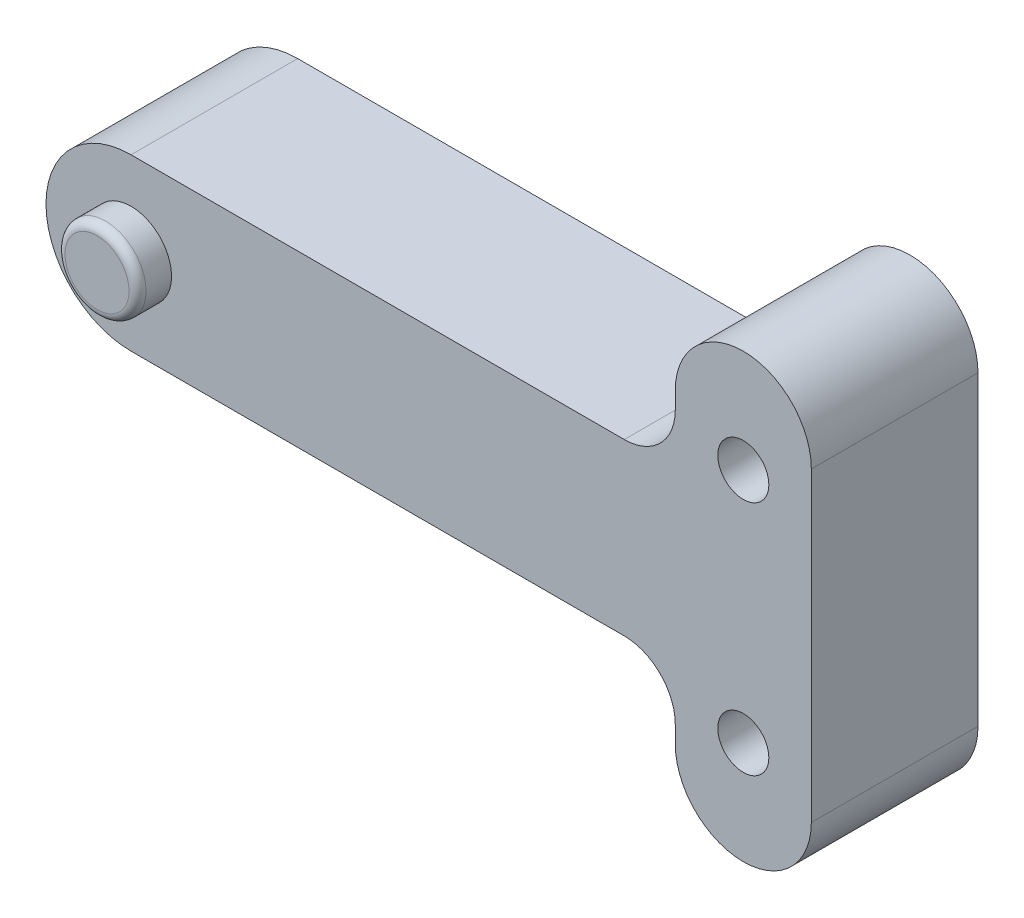
ISO-10303-21;
HEADER;
FILE_DESCRIPTION(('STEP AP214'),'2;1');
FILE_NAME('part.step','',(''),(''),'','','');
FILE_SCHEMA(('AUTOMOTIVE_DESIGN { 1 0 10303 214 1 1 1 1 }'));
ENDSEC;
DATA;
#1=APPLICATION_CONTEXT('core data for automotive mechanical design processes');
#2=APPLICATION_PROTOCOL_DEFINITION('international standard','automotive_design',2000,#1);
#3=PRODUCT_CONTEXT('',#1,'mechanical');
#4=PRODUCT('Part','Part','',(#3));
#5=PRODUCT_RELATED_PRODUCT_CATEGORY('part','',(#4));
#6=PRODUCT_DEFINITION_FORMATION('','',#4);
#7=PRODUCT_DEFINITION_CONTEXT('part definition',#1,'design');
#8=PRODUCT_DEFINITION('design','',#6,#7);
#9=PRODUCT_DEFINITION_SHAPE('','',#8);
#10=(LENGTH_UNIT() NAMED_UNIT(*) SI_UNIT(.MILLI.,.METRE.));
#11=(NAMED_UNIT(*) PLANE_ANGLE_UNIT() SI_UNIT($,.RADIAN.));
#12=(NAMED_UNIT(*) SI_UNIT($,.STERADIAN.) SOLID_ANGLE_UNIT());
#13=UNCERTAINTY_MEASURE_WITH_UNIT(LENGTH_MEASURE(1.E-05),#10,'distance_accuracy_value','');
#14=(GEOMETRIC_REPRESENTATION_CONTEXT(3) GLOBAL_UNCERTAINTY_ASSIGNED_CONTEXT((#13)) GLOBAL_UNIT_ASSIGNED_CONTEXT((#10,
#11,#12)) REPRESENTATION_CONTEXT('',''));
#15=CARTESIAN_POINT('',(0.,0.,0.));
#16=DIRECTION('',(0.,0.,1.));
#17=DIRECTION('',(1.,0.,0.));
#18=AXIS2_PLACEMENT_3D('',#15,#16,#17);
#19=CARTESIAN_POINT('',(-5.,-5.,4.9));
#20=DIRECTION('',(0.,0.,-1.));
#21=DIRECTION('',(-1.,0.,0.));
#22=AXIS2_PLACEMENT_3D('',#19,#20,#21);
#23=PLANE('',#22);
#24=CARTESIAN_POINT('',(0.,0.,4.9));
#25=DIRECTION('',(0.,0.,-1.));
#26=DIRECTION('',(-1.,0.,0.));
#27=AXIS2_PLACEMENT_3D('',#24,#25,#26);
#28=CIRCLE('',#27,2.38);
#29=CARTESIAN_POINT('',(-2.38,0.,4.9));
#30=VERTEX_POINT('',#29);
#31=EDGE_CURVE('E186',#30,#30,#28,.F.);
#32=ORIENTED_EDGE('',*,*,#31,.F.);
#33=EDGE_LOOP('',(#32));
#34=FACE_BOUND('',#33,.T.);
#35=DIRECTION('',(0.,-1.,0.));
#36=VECTOR('',#35,1.);
#37=CARTESIAN_POINT('',(40.,5.00000000000001,4.9));
#38=LINE('',#37,#36);
#39=CARTESIAN_POINT('',(40.,9.,4.9));
#40=VERTEX_POINT('',#39);
#41=CARTESIAN_POINT('',(40.,-9.,4.9));
#42=VERTEX_POINT('',#41);
#43=EDGE_CURVE('E174',#40,#42,#38,.T.);
#44=ORIENTED_EDGE('',*,*,#43,.F.);
#45=CARTESIAN_POINT('',(36.,9.,4.9));
#46=DIRECTION('',(0.,0.,-1.));
#47=DIRECTION('',(-1.,0.,0.));
#48=AXIS2_PLACEMENT_3D('',#45,#46,#47);
#49=CIRCLE('',#48,4.);
#50=CARTESIAN_POINT('',(32.,9.,4.9));
#51=VERTEX_POINT('',#50);
#52=EDGE_CURVE('E171',#51,#40,#49,.T.);
#53=ORIENTED_EDGE('',*,*,#52,.F.);
#54=DIRECTION('',(0.,1.,0.));
#55=VECTOR('',#54,1.);
#56=CARTESIAN_POINT('',(32.,9.,4.9));
#57=LINE('',#56,#55);
#58=CARTESIAN_POINT('',(32.,8.,4.9));
#59=VERTEX_POINT('',#58);
#60=EDGE_CURVE('E167',#59,#51,#57,.T.);
#61=ORIENTED_EDGE('',*,*,#60,.F.);
#62=CARTESIAN_POINT('',(29.,8.,4.9));
#63=DIRECTION('',(0.,0.,-1.));
#64=DIRECTION('',(-1.,0.,0.));
#65=AXIS2_PLACEMENT_3D('',#62,#63,#64);
#66=CIRCLE('',#65,3.);
#67=CARTESIAN_POINT('',(29.,5.,4.9));
#68=VERTEX_POINT('',#67);
#69=EDGE_CURVE('E56',#59,#68,#66,.T.);
#70=ORIENTED_EDGE('',*,*,#69,.T.);
#71=DIRECTION('',(1.,0.,0.));
#72=VECTOR('',#71,1.);
#73=CARTESIAN_POINT('',(0.,5.,4.9));
#74=LINE('',#73,#72);
#75=CARTESIAN_POINT('',(0.,5.,4.9));
#76=VERTEX_POINT('',#75);
#77=EDGE_CURVE('E214',#76,#68,#74,.T.);
#78=ORIENTED_EDGE('',*,*,#77,.F.);
#79=CARTESIAN_POINT('',(0.,0.,4.9));
#80=DIRECTION('',(0.,0.,-1.));
#81=DIRECTION('',(-1.,0.,0.));
#82=AXIS2_PLACEMENT_3D('',#79,#80,#81);
#83=CIRCLE('',#82,5.);
#84=CARTESIAN_POINT('',(0.,-5.,4.9));
#85=VERTEX_POINT('',#84);
#86=EDGE_CURVE('E196',#76,#85,#83,.F.);
#87=ORIENTED_EDGE('',*,*,#86,.T.);
#88=DIRECTION('',(-1.,0.,0.));
#89=VECTOR('',#88,1.);
#90=CARTESIAN_POINT('',(-5.,-5.,4.9));
#91=LINE('',#90,#89);
#92=CARTESIAN_POINT('',(29.,-5.,4.9));
#93=VERTEX_POINT('',#92);
#94=EDGE_CURVE('E185',#93,#85,#91,.T.);
#95=ORIENTED_EDGE('',*,*,#94,.F.);
#96=CARTESIAN_POINT('',(29.,-8.,4.9));
#97=DIRECTION('',(0.,0.,-1.));
#98=DIRECTION('',(-1.,0.,0.));
#99=AXIS2_PLACEMENT_3D('',#96,#97,#98);
#100=CIRCLE('',#99,3.);
#101=CARTESIAN_POINT('',(32.,-8.,4.9));
#102=VERTEX_POINT('',#101);
#103=EDGE_CURVE('E261',#93,#102,#100,.T.);
#104=ORIENTED_EDGE('',*,*,#103,.T.);
#105=CARTESIAN_POINT('',(32.,-9.,4.9));
#106=VERTEX_POINT('',#105);
#107=EDGE_CURVE('E168',#106,#102,#57,.T.);
#108=ORIENTED_EDGE('',*,*,#107,.F.);
#109=CARTESIAN_POINT('',(36.,-9.,4.9));
#110=DIRECTION('',(0.,0.,-1.));
#111=DIRECTION('',(-1.,0.,0.));
#112=AXIS2_PLACEMENT_3D('',#109,#110,#111);
#113=CIRCLE('',#112,4.);
#114=EDGE_CURVE('E131',#42,#106,#113,.T.);
#115=ORIENTED_EDGE('',*,*,#114,.F.);
#116=EDGE_LOOP('',(#44,#53,#61,#70,#78,#87,#95,#104,#108,#115));
#117=FACE_BOUND('',#116,.T.);
#118=CARTESIAN_POINT('',(36.,-6.95,4.9));
#119=DIRECTION('',(0.,0.,-1.));
#120=DIRECTION('',(-1.,0.,0.));
#121=AXIS2_PLACEMENT_3D('',#118,#119,#120);
#122=CIRCLE('',#121,1.5);
#123=CARTESIAN_POINT('',(34.5,-6.95,4.9));
#124=VERTEX_POINT('',#123);
#125=EDGE_CURVE('E242',#124,#124,#122,.F.);
#126=ORIENTED_EDGE('',*,*,#125,.F.);
#127=EDGE_LOOP('',(#126));
#128=FACE_BOUND('',#127,.T.);
#129=CARTESIAN_POINT('',(36.,6.95,4.9));
#130=DIRECTION('',(0.,0.,-1.));
#131=DIRECTION('',(-1.,0.,0.));
#132=AXIS2_PLACEMENT_3D('',#129,#130,#131);
#133=CIRCLE('',#132,1.5);
#134=CARTESIAN_POINT('',(34.5,6.95,4.9));
#135=VERTEX_POINT('',#134);
#136=EDGE_CURVE('E149',#135,#135,#133,.T.);
#137=ORIENTED_EDGE('',*,*,#136,.T.);
#138=EDGE_LOOP('',(#137));
#139=FACE_BOUND('',#138,.T.);
#140=ADVANCED_FACE('F47',(#34,#117,#128,#139),#23,.F.);
#141=CARTESIAN_POINT('',(-5.,-5.,-4.9));
#142=DIRECTION('',(0.,0.,1.));
#143=DIRECTION('',(1.,0.,0.));
#144=AXIS2_PLACEMENT_3D('',#141,#142,#143);
#145=PLANE('',#144);
#146=CARTESIAN_POINT('',(0.,0.,-4.9));
#147=DIRECTION('',(0.,0.,1.));
#148=DIRECTION('',(1.,0.,0.));
#149=AXIS2_PLACEMENT_3D('',#146,#147,#148);
#150=CIRCLE('',#149,2.38);
#151=CARTESIAN_POINT('',(2.38,0.,-4.9));
#152=VERTEX_POINT('',#151);
#153=EDGE_CURVE('E191',#152,#152,#150,.F.);
#154=ORIENTED_EDGE('',*,*,#153,.F.);
#155=EDGE_LOOP('',(#154));
#156=FACE_BOUND('',#155,.T.);
#157=DIRECTION('',(0.,1.,0.));
#158=VECTOR('',#157,1.);
#159=CARTESIAN_POINT('',(40.,-4.99999999999999,-4.9));
#160=LINE('',#159,#158);
#161=CARTESIAN_POINT('',(40.,-9.,-4.9));
#162=VERTEX_POINT('',#161);
#163=CARTESIAN_POINT('',(40.,9.,-4.9));
#164=VERTEX_POINT('',#163);
#165=EDGE_CURVE('E145',#162,#164,#160,.T.);
#166=ORIENTED_EDGE('',*,*,#165,.F.);
#167=CARTESIAN_POINT('',(36.,-9.,-4.9));
#168=DIRECTION('',(0.,0.,1.));
#169=DIRECTION('',(1.,0.,0.));
#170=AXIS2_PLACEMENT_3D('',#167,#168,#169);
#171=CIRCLE('',#170,4.);
#172=CARTESIAN_POINT('',(32.,-9.,-4.9));
#173=VERTEX_POINT('',#172);
#174=EDGE_CURVE('E129',#162,#173,#171,.F.);
#175=ORIENTED_EDGE('',*,*,#174,.T.);
#176=DIRECTION('',(0.,1.,0.));
#177=VECTOR('',#176,1.);
#178=CARTESIAN_POINT('',(32.,9.,-4.9));
#179=LINE('',#178,#177);
#180=CARTESIAN_POINT('',(32.,-8.,-4.9));
#181=VERTEX_POINT('',#180);
#182=EDGE_CURVE('E143',#173,#181,#179,.T.);
#183=ORIENTED_EDGE('',*,*,#182,.T.);
#184=CARTESIAN_POINT('',(29.,-8.,-4.9));
#185=DIRECTION('',(0.,0.,1.));
#186=DIRECTION('',(1.,0.,0.));
#187=AXIS2_PLACEMENT_3D('',#184,#185,#186);
#188=CIRCLE('',#187,3.);
#189=CARTESIAN_POINT('',(29.,-5.,-4.9));
#190=VERTEX_POINT('',#189);
#191=EDGE_CURVE('E258',#181,#190,#188,.T.);
#192=ORIENTED_EDGE('',*,*,#191,.T.);
#193=DIRECTION('',(1.,0.,0.));
#194=VECTOR('',#193,1.);
#195=CARTESIAN_POINT('',(-5.,-5.,-4.9));
#196=LINE('',#195,#194);
#197=CARTESIAN_POINT('',(0.,-5.,-4.9));
#198=VERTEX_POINT('',#197);
#199=EDGE_CURVE('E192',#198,#190,#196,.T.);
#200=ORIENTED_EDGE('',*,*,#199,.F.);
#201=CARTESIAN_POINT('',(0.,0.,-4.9));
#202=DIRECTION('',(0.,0.,1.));
#203=DIRECTION('',(1.,0.,0.));
#204=AXIS2_PLACEMENT_3D('',#201,#202,#203);
#205=CIRCLE('',#204,5.);
#206=CARTESIAN_POINT('',(0.,5.,-4.9));
#207=VERTEX_POINT('',#206);
#208=EDGE_CURVE('E202',#198,#207,#205,.F.);
#209=ORIENTED_EDGE('',*,*,#208,.T.);
#210=DIRECTION('',(-1.,0.,0.));
#211=VECTOR('',#210,1.);
#212=CARTESIAN_POINT('',(0.,5.,-4.9));
#213=LINE('',#212,#211);
#214=CARTESIAN_POINT('',(29.,5.,-4.9));
#215=VERTEX_POINT('',#214);
#216=EDGE_CURVE('E217',#215,#207,#213,.T.);
#217=ORIENTED_EDGE('',*,*,#216,.F.);
#218=CARTESIAN_POINT('',(29.,8.,-4.9));
#219=DIRECTION('',(0.,0.,1.));
#220=DIRECTION('',(1.,0.,0.));
#221=AXIS2_PLACEMENT_3D('',#218,#219,#220);
#222=CIRCLE('',#221,3.);
#223=CARTESIAN_POINT('',(32.,8.,-4.9));
#224=VERTEX_POINT('',#223);
#225=EDGE_CURVE('E12',#215,#224,#222,.T.);
#226=ORIENTED_EDGE('',*,*,#225,.T.);
#227=CARTESIAN_POINT('',(32.,9.,-4.9));
#228=VERTEX_POINT('',#227);
#229=EDGE_CURVE('E157',#224,#228,#179,.T.);
#230=ORIENTED_EDGE('',*,*,#229,.T.);
#231=CARTESIAN_POINT('',(36.,9.,-4.9));
#232=DIRECTION('',(0.,0.,1.));
#233=DIRECTION('',(1.,0.,0.));
#234=AXIS2_PLACEMENT_3D('',#231,#232,#233);
#235=CIRCLE('',#234,4.);
#236=EDGE_CURVE('E148',#228,#164,#235,.F.);
#237=ORIENTED_EDGE('',*,*,#236,.T.);
#238=EDGE_LOOP('',(#166,#175,#183,#192,#200,#209,#217,#226,#230,#237));
#239=FACE_BOUND('',#238,.T.);
#240=CARTESIAN_POINT('',(36.,-6.95,-4.9));
#241=DIRECTION('',(0.,0.,1.));
#242=DIRECTION('',(1.,0.,0.));
#243=AXIS2_PLACEMENT_3D('',#240,#241,#242);
#244=CIRCLE('',#243,1.5);
#245=CARTESIAN_POINT('',(37.5,-6.95,-4.9));
#246=VERTEX_POINT('',#245);
#247=EDGE_CURVE('E238',#246,#246,#244,.F.);
#248=ORIENTED_EDGE('',*,*,#247,.F.);
#249=EDGE_LOOP('',(#248));
#250=FACE_BOUND('',#249,.T.);
#251=CARTESIAN_POINT('',(36.,6.95,-4.9));
#252=DIRECTION('',(0.,0.,1.));
#253=DIRECTION('',(1.,0.,0.));
#254=AXIS2_PLACEMENT_3D('',#251,#252,#253);
#255=CIRCLE('',#254,1.5);
#256=CARTESIAN_POINT('',(37.5,6.95,-4.9));
#257=VERTEX_POINT('',#256);
#258=EDGE_CURVE('E243',#257,#257,#255,.T.);
#259=ORIENTED_EDGE('',*,*,#258,.T.);
#260=EDGE_LOOP('',(#259));
#261=FACE_BOUND('',#260,.T.);
#262=ADVANCED_FACE('F141',(#156,#239,#250,#261),#145,.F.);
#263=CARTESIAN_POINT('',(0.,-5.,-20.));
#264=DIRECTION('',(0.,1.,0.));
#265=DIRECTION('',(0.,0.,1.));
#266=AXIS2_PLACEMENT_3D('',#263,#264,#265);
#267=PLANE('',#266);
#268=ORIENTED_EDGE('',*,*,#199,.T.);
#269=DIRECTION('',(0.,0.,-1.));
#270=VECTOR('',#269,1.);
#271=CARTESIAN_POINT('',(29.,-5.,4.9));
#272=LINE('',#271,#270);
#273=EDGE_CURVE('E249',#190,#93,#272,.F.);
#274=ORIENTED_EDGE('',*,*,#273,.T.);
#275=ORIENTED_EDGE('',*,*,#94,.T.);
#276=DIRECTION('',(0.,0.,1.));
#277=VECTOR('',#276,1.);
#278=CARTESIAN_POINT('',(0.,-5.,-20.));
#279=LINE('',#278,#277);
#280=EDGE_CURVE('E210',#198,#85,#279,.T.);
#281=ORIENTED_EDGE('',*,*,#280,.F.);
#282=EDGE_LOOP('',(#268,#274,#275,#281));
#283=FACE_BOUND('',#282,.T.);
#284=ADVANCED_FACE('F333',(#283),#267,.F.);
#285=CARTESIAN_POINT('',(0.,5.,-20.));
#286=DIRECTION('',(0.,-1.,0.));
#287=DIRECTION('',(0.,0.,-1.));
#288=AXIS2_PLACEMENT_3D('',#285,#286,#287);
#289=PLANE('',#288);
#290=ORIENTED_EDGE('',*,*,#77,.T.);
#291=DIRECTION('',(0.,0.,1.));
#292=VECTOR('',#291,1.);
#293=CARTESIAN_POINT('',(29.,5.,-4.9));
#294=LINE('',#293,#292);
#295=EDGE_CURVE('E69',#68,#215,#294,.F.);
#296=ORIENTED_EDGE('',*,*,#295,.T.);
#297=ORIENTED_EDGE('',*,*,#216,.T.);
#298=DIRECTION('',(0.,0.,1.));
#299=VECTOR('',#298,1.);
#300=CARTESIAN_POINT('',(0.,5.,-20.));
#301=LINE('',#300,#299);
#302=EDGE_CURVE('E206',#207,#76,#301,.T.);
#303=ORIENTED_EDGE('',*,*,#302,.T.);
#304=EDGE_LOOP('',(#290,#296,#297,#303));
#305=FACE_BOUND('',#304,.T.);
#306=ADVANCED_FACE('F338',(#305),#289,.F.);
#307=CARTESIAN_POINT('',(0.,0.,-20.));
#308=DIRECTION('',(0.,0.,1.));
#309=DIRECTION('',(1.,0.,0.));
#310=AXIS2_PLACEMENT_3D('',#307,#308,#309);
#311=CYLINDRICAL_SURFACE('',#310,5.);
#312=ORIENTED_EDGE('',*,*,#208,.F.);
#313=ORIENTED_EDGE('',*,*,#280,.T.);
#314=ORIENTED_EDGE('',*,*,#86,.F.);
#315=ORIENTED_EDGE('',*,*,#302,.F.);
#316=EDGE_LOOP('',(#312,#313,#314,#315));
#317=FACE_BOUND('',#316,.T.);
#318=ADVANCED_FACE('F321',(#317),#311,.T.);
#319=CARTESIAN_POINT('',(-5.,-5.,-6.9));
#320=DIRECTION('',(0.,0.,1.));
#321=DIRECTION('',(1.,0.,0.));
#322=AXIS2_PLACEMENT_3D('',#319,#320,#321);
#323=PLANE('',#322);
#324=CARTESIAN_POINT('',(0.,0.,-6.9));
#325=DIRECTION('',(0.,0.,1.));
#326=DIRECTION('',(1.,0.,0.));
#327=AXIS2_PLACEMENT_3D('',#324,#325,#326);
#328=CIRCLE('',#327,1.88);
#329=CARTESIAN_POINT('',(1.88,0.,-6.9));
#330=VERTEX_POINT('',#329);
#331=EDGE_CURVE('E190',#330,#330,#328,.F.);
#332=ORIENTED_EDGE('',*,*,#331,.T.);
#333=EDGE_LOOP('',(#332));
#334=FACE_BOUND('',#333,.T.);
#335=ADVANCED_FACE('F317',(#334),#323,.F.);
#336=CARTESIAN_POINT('',(0.,0.,15.6316565568959));
#337=DIRECTION('',(0.,0.,-1.));
#338=DIRECTION('',(-1.,0.,0.));
#339=AXIS2_PLACEMENT_3D('',#336,#337,#338);
#340=CYLINDRICAL_SURFACE('',#339,2.38);
#341=CARTESIAN_POINT('',(0.,0.,-6.4));
#342=DIRECTION('',(0.,0.,1.));
#343=DIRECTION('',(1.,0.,0.));
#344=AXIS2_PLACEMENT_3D('',#341,#342,#343);
#345=CIRCLE('',#344,2.38);
#346=CARTESIAN_POINT('',(2.38,0.,-6.4));
#347=VERTEX_POINT('',#346);
#348=EDGE_CURVE('E226',#347,#347,#345,.T.);
#349=ORIENTED_EDGE('',*,*,#348,.T.);
#350=EDGE_LOOP('',(#349));
#351=FACE_BOUND('',#350,.T.);
#352=ORIENTED_EDGE('',*,*,#153,.T.);
#353=EDGE_LOOP('',(#352));
#354=FACE_BOUND('',#353,.T.);
#355=ADVANCED_FACE('F320',(#351,#354),#340,.T.);
#356=CARTESIAN_POINT('',(0.,0.,6.4));
#357=DIRECTION('',(0.,0.,-1.));
#358=DIRECTION('',(-1.,0.,0.));
#359=AXIS2_PLACEMENT_3D('',#356,#357,#358);
#360=CIRCLE('',#359,2.38);
#361=CARTESIAN_POINT('',(-2.38,0.,6.4));
#362=VERTEX_POINT('',#361);
#363=EDGE_CURVE('E230',#362,#362,#360,.T.);
#364=ORIENTED_EDGE('',*,*,#363,.T.);
#365=EDGE_LOOP('',(#364));
#366=FACE_BOUND('',#365,.T.);
#367=ORIENTED_EDGE('',*,*,#31,.T.);
#368=EDGE_LOOP('',(#367));
#369=FACE_BOUND('',#368,.T.);
#370=ADVANCED_FACE('F327',(#366,#369),#340,.T.);
#371=CARTESIAN_POINT('',(-5.,-5.,6.9));
#372=DIRECTION('',(0.,0.,-1.));
#373=DIRECTION('',(-1.,0.,0.));
#374=AXIS2_PLACEMENT_3D('',#371,#372,#373);
#375=PLANE('',#374);
#376=CARTESIAN_POINT('',(0.,0.,6.9));
#377=DIRECTION('',(0.,0.,-1.));
#378=DIRECTION('',(-1.,0.,0.));
#379=AXIS2_PLACEMENT_3D('',#376,#377,#378);
#380=CIRCLE('',#379,1.88);
#381=CARTESIAN_POINT('',(-1.88,0.,6.9));
#382=VERTEX_POINT('',#381);
#383=EDGE_CURVE('E234',#382,#382,#380,.F.);
#384=ORIENTED_EDGE('',*,*,#383,.T.);
#385=EDGE_LOOP('',(#384));
#386=FACE_BOUND('',#385,.T.);
#387=ADVANCED_FACE('F323',(#386),#375,.F.);
#388=CARTESIAN_POINT('',(0.,0.,-6.4));
#389=DIRECTION('',(0.,0.,1.));
#390=DIRECTION('',(1.,0.,0.));
#391=AXIS2_PLACEMENT_3D('',#388,#389,#390);
#392=TOROIDAL_SURFACE('',#391,1.88,0.5);
#393=ORIENTED_EDGE('',*,*,#348,.F.);
#394=EDGE_LOOP('',(#393));
#395=FACE_BOUND('',#394,.T.);
#396=ORIENTED_EDGE('',*,*,#331,.F.);
#397=EDGE_LOOP('',(#396));
#398=FACE_BOUND('',#397,.T.);
#399=ADVANCED_FACE('F326',(#395,#398),#392,.T.);
#400=CARTESIAN_POINT('',(0.,0.,6.4));
#401=DIRECTION('',(0.,0.,-1.));
#402=DIRECTION('',(-1.,0.,0.));
#403=AXIS2_PLACEMENT_3D('',#400,#401,#402);
#404=TOROIDAL_SURFACE('',#403,1.88,0.5);
#405=ORIENTED_EDGE('',*,*,#383,.F.);
#406=EDGE_LOOP('',(#405));
#407=FACE_BOUND('',#406,.T.);
#408=ORIENTED_EDGE('',*,*,#363,.F.);
#409=EDGE_LOOP('',(#408));
#410=FACE_BOUND('',#409,.T.);
#411=ADVANCED_FACE('F315',(#407,#410),#404,.T.);
#412=CARTESIAN_POINT('',(40.,0.,0.));
#413=DIRECTION('',(1.,0.,0.));
#414=DIRECTION('',(0.,1.,0.));
#415=AXIS2_PLACEMENT_3D('',#412,#413,#414);
#416=PLANE('',#415);
#417=ORIENTED_EDGE('',*,*,#43,.T.);
#418=DIRECTION('',(0.,0.,-1.));
#419=VECTOR('',#418,1.);
#420=CARTESIAN_POINT('',(40.,-9.,32.1029410174709));
#421=LINE('',#420,#419);
#422=EDGE_CURVE('E137',#42,#162,#421,.T.);
#423=ORIENTED_EDGE('',*,*,#422,.T.);
#424=ORIENTED_EDGE('',*,*,#165,.T.);
#425=DIRECTION('',(0.,0.,-1.));
#426=VECTOR('',#425,1.);
#427=CARTESIAN_POINT('',(40.,9.,32.1029410174709));
#428=LINE('',#427,#426);
#429=EDGE_CURVE('E156',#40,#164,#428,.T.);
#430=ORIENTED_EDGE('',*,*,#429,.F.);
#431=EDGE_LOOP('',(#417,#423,#424,#430));
#432=FACE_BOUND('',#431,.T.);
#433=ADVANCED_FACE('F312',(#432),#416,.T.);
#434=CARTESIAN_POINT('',(36.,9.,32.1029410174709));
#435=DIRECTION('',(0.,0.,-1.));
#436=DIRECTION('',(-1.,0.,0.));
#437=AXIS2_PLACEMENT_3D('',#434,#435,#436);
#438=CYLINDRICAL_SURFACE('',#437,4.);
#439=DIRECTION('',(0.,0.,-1.));
#440=VECTOR('',#439,1.);
#441=CARTESIAN_POINT('',(32.,9.,32.1029410174709));
#442=LINE('',#441,#440);
#443=EDGE_CURVE('E136',#51,#228,#442,.T.);
#444=ORIENTED_EDGE('',*,*,#443,.F.);
#445=ORIENTED_EDGE('',*,*,#52,.T.);
#446=ORIENTED_EDGE('',*,*,#429,.T.);
#447=ORIENTED_EDGE('',*,*,#236,.F.);
#448=EDGE_LOOP('',(#444,#445,#446,#447));
#449=FACE_BOUND('',#448,.T.);
#450=ADVANCED_FACE('F275',(#449),#438,.T.);
#451=CARTESIAN_POINT('',(32.,9.,32.1029410174709));
#452=DIRECTION('',(1.,0.,0.));
#453=DIRECTION('',(0.,0.,-1.));
#454=AXIS2_PLACEMENT_3D('',#451,#452,#453);
#455=PLANE('',#454);
#456=ORIENTED_EDGE('',*,*,#229,.F.);
#457=DIRECTION('',(0.,0.,1.));
#458=VECTOR('',#457,1.);
#459=CARTESIAN_POINT('',(32.,8.,4.9));
#460=LINE('',#459,#458);
#461=EDGE_CURVE('E252',#224,#59,#460,.T.);
#462=ORIENTED_EDGE('',*,*,#461,.T.);
#463=ORIENTED_EDGE('',*,*,#60,.T.);
#464=ORIENTED_EDGE('',*,*,#443,.T.);
#465=EDGE_LOOP('',(#456,#462,#463,#464));
#466=FACE_BOUND('',#465,.T.);
#467=ADVANCED_FACE('F268',(#466),#455,.F.);
#468=ORIENTED_EDGE('',*,*,#107,.T.);
#469=DIRECTION('',(0.,0.,-1.));
#470=VECTOR('',#469,1.);
#471=CARTESIAN_POINT('',(32.,-8.,-4.9));
#472=LINE('',#471,#470);
#473=EDGE_CURVE('E154',#102,#181,#472,.T.);
#474=ORIENTED_EDGE('',*,*,#473,.T.);
#475=ORIENTED_EDGE('',*,*,#182,.F.);
#476=DIRECTION('',(0.,0.,-1.));
#477=VECTOR('',#476,1.);
#478=CARTESIAN_POINT('',(32.,-9.,32.1029410174709));
#479=LINE('',#478,#477);
#480=EDGE_CURVE('E125',#106,#173,#479,.T.);
#481=ORIENTED_EDGE('',*,*,#480,.F.);
#482=EDGE_LOOP('',(#468,#474,#475,#481));
#483=FACE_BOUND('',#482,.T.);
#484=ADVANCED_FACE('F152',(#483),#455,.F.);
#485=CARTESIAN_POINT('',(36.,-9.,32.1029410174709));
#486=DIRECTION('',(0.,0.,-1.));
#487=DIRECTION('',(-1.,0.,0.));
#488=AXIS2_PLACEMENT_3D('',#485,#486,#487);
#489=CYLINDRICAL_SURFACE('',#488,4.);
#490=ORIENTED_EDGE('',*,*,#422,.F.);
#491=ORIENTED_EDGE('',*,*,#114,.T.);
#492=ORIENTED_EDGE('',*,*,#480,.T.);
#493=ORIENTED_EDGE('',*,*,#174,.F.);
#494=EDGE_LOOP('',(#490,#491,#492,#493));
#495=FACE_BOUND('',#494,.T.);
#496=ADVANCED_FACE('F128',(#495),#489,.T.);
#497=CARTESIAN_POINT('',(36.,-6.95,-6.9));
#498=DIRECTION('',(0.,0.,1.));
#499=DIRECTION('',(1.,0.,0.));
#500=AXIS2_PLACEMENT_3D('',#497,#498,#499);
#501=CYLINDRICAL_SURFACE('',#500,1.5);
#502=ORIENTED_EDGE('',*,*,#247,.T.);
#503=EDGE_LOOP('',(#502));
#504=FACE_BOUND('',#503,.T.);
#505=ORIENTED_EDGE('',*,*,#125,.T.);
#506=EDGE_LOOP('',(#505));
#507=FACE_BOUND('',#506,.T.);
#508=ADVANCED_FACE('F285',(#504,#507),#501,.F.);
#509=CARTESIAN_POINT('',(36.,6.95,-6.9));
#510=DIRECTION('',(0.,0.,1.));
#511=DIRECTION('',(1.,0.,0.));
#512=AXIS2_PLACEMENT_3D('',#509,#510,#511);
#513=CYLINDRICAL_SURFACE('',#512,1.5);
#514=ORIENTED_EDGE('',*,*,#258,.F.);
#515=EDGE_LOOP('',(#514));
#516=FACE_BOUND('',#515,.T.);
#517=ORIENTED_EDGE('',*,*,#136,.F.);
#518=EDGE_LOOP('',(#517));
#519=FACE_BOUND('',#518,.T.);
#520=ADVANCED_FACE('F292',(#516,#519),#513,.F.);
#521=CARTESIAN_POINT('',(29.,-8.,32.1029410174709));
#522=DIRECTION('',(0.,0.,1.));
#523=DIRECTION('',(1.,0.,0.));
#524=AXIS2_PLACEMENT_3D('',#521,#522,#523);
#525=CYLINDRICAL_SURFACE('',#524,3.);
#526=ORIENTED_EDGE('',*,*,#103,.F.);
#527=ORIENTED_EDGE('',*,*,#273,.F.);
#528=ORIENTED_EDGE('',*,*,#191,.F.);
#529=ORIENTED_EDGE('',*,*,#473,.F.);
#530=EDGE_LOOP('',(#526,#527,#528,#529));
#531=FACE_BOUND('',#530,.T.);
#532=ADVANCED_FACE('F294',(#531),#525,.F.);
#533=CARTESIAN_POINT('',(29.,8.,32.1029410174709));
#534=DIRECTION('',(0.,0.,-1.));
#535=DIRECTION('',(-1.,0.,0.));
#536=AXIS2_PLACEMENT_3D('',#533,#534,#535);
#537=CYLINDRICAL_SURFACE('',#536,3.);
#538=ORIENTED_EDGE('',*,*,#225,.F.);
#539=ORIENTED_EDGE('',*,*,#295,.F.);
#540=ORIENTED_EDGE('',*,*,#69,.F.);
#541=ORIENTED_EDGE('',*,*,#461,.F.);
#542=EDGE_LOOP('',(#538,#539,#540,#541));
#543=FACE_BOUND('',#542,.T.);
#544=ADVANCED_FACE('F49',(#543),#537,.F.);
#545=CLOSED_SHELL('',(#140,#262,#284,#306,#318,#335,#355,#370,#387,#399,#411,#433,#450,#467,
#484,#496,#508,#520,#532,#544));
#546=MANIFOLD_SOLID_BREP('B2',#545);
#547=ADVANCED_BREP_SHAPE_REPRESENTATION('',(#18,#546),#14);
#548=SHAPE_DEFINITION_REPRESENTATION(#9,#547);
ENDSEC;
END-ISO-10303-21;
